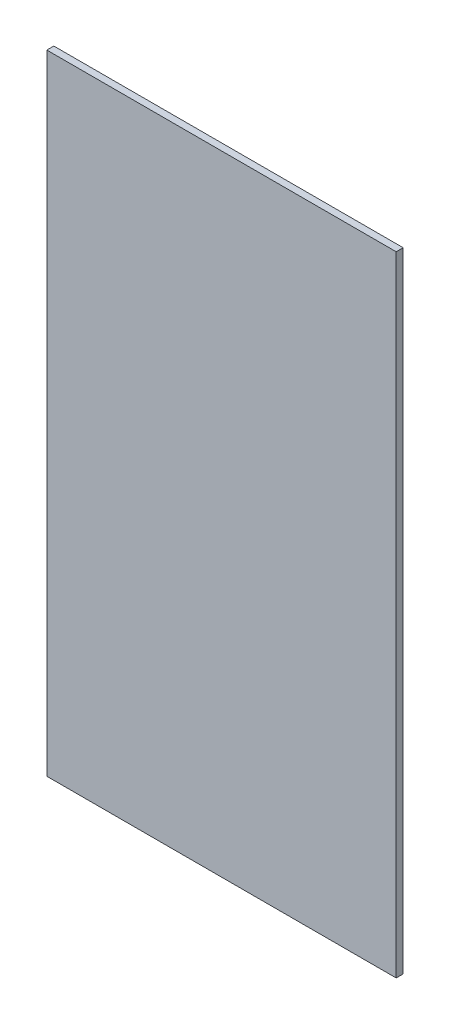
ISO-10303-21;
HEADER;
FILE_DESCRIPTION(('STEP AP214'),'2;1');
FILE_NAME('part.step','',(''),(''),'','','');
FILE_SCHEMA(('AUTOMOTIVE_DESIGN { 1 0 10303 214 1 1 1 1 }'));
ENDSEC;
DATA;
#1=APPLICATION_CONTEXT('core data for automotive mechanical design processes');
#2=APPLICATION_PROTOCOL_DEFINITION('international standard','automotive_design',2000,#1);
#3=PRODUCT_CONTEXT('',#1,'mechanical');
#4=PRODUCT('Part','Part','',(#3));
#5=PRODUCT_RELATED_PRODUCT_CATEGORY('part','',(#4));
#6=PRODUCT_DEFINITION_FORMATION('','',#4);
#7=PRODUCT_DEFINITION_CONTEXT('part definition',#1,'design');
#8=PRODUCT_DEFINITION('design','',#6,#7);
#9=PRODUCT_DEFINITION_SHAPE('','',#8);
#10=(LENGTH_UNIT() NAMED_UNIT(*) SI_UNIT(.MILLI.,.METRE.));
#11=(NAMED_UNIT(*) PLANE_ANGLE_UNIT() SI_UNIT($,.RADIAN.));
#12=(NAMED_UNIT(*) SI_UNIT($,.STERADIAN.) SOLID_ANGLE_UNIT());
#13=UNCERTAINTY_MEASURE_WITH_UNIT(LENGTH_MEASURE(1.E-05),#10,'distance_accuracy_value','');
#14=(GEOMETRIC_REPRESENTATION_CONTEXT(3) GLOBAL_UNCERTAINTY_ASSIGNED_CONTEXT((#13)) GLOBAL_UNIT_ASSIGNED_CONTEXT((#10,
#11,#12)) REPRESENTATION_CONTEXT('',''));
#15=CARTESIAN_POINT('',(0.,0.,0.));
#16=DIRECTION('',(0.,0.,1.));
#17=DIRECTION('',(1.,0.,0.));
#18=AXIS2_PLACEMENT_3D('',#15,#16,#17);
#19=CARTESIAN_POINT('',(2500.,4500.,50.));
#20=DIRECTION('',(-1.,0.,0.));
#21=DIRECTION('',(0.,-1.,0.));
#22=AXIS2_PLACEMENT_3D('',#19,#20,#21);
#23=PLANE('',#22);
#24=DIRECTION('',(0.,1.,0.));
#25=VECTOR('',#24,1.);
#26=CARTESIAN_POINT('',(2500.,4500.,-50.));
#27=LINE('',#26,#25);
#28=CARTESIAN_POINT('',(2500.,-4500.,-50.));
#29=VERTEX_POINT('',#28);
#30=CARTESIAN_POINT('',(2500.,4500.,-50.));
#31=VERTEX_POINT('',#30);
#32=EDGE_CURVE('E98',#29,#31,#27,.T.);
#33=ORIENTED_EDGE('',*,*,#32,.T.);
#34=DIRECTION('',(0.,0.,-1.));
#35=VECTOR('',#34,1.);
#36=CARTESIAN_POINT('',(2500.,4500.,50.));
#37=LINE('',#36,#35);
#38=CARTESIAN_POINT('',(2500.,4500.,50.));
#39=VERTEX_POINT('',#38);
#40=EDGE_CURVE('E11',#39,#31,#37,.T.);
#41=ORIENTED_EDGE('',*,*,#40,.F.);
#42=DIRECTION('',(0.,1.,0.));
#43=VECTOR('',#42,1.);
#44=CARTESIAN_POINT('',(2500.,4500.,50.));
#45=LINE('',#44,#43);
#46=CARTESIAN_POINT('',(2500.,-4500.,50.));
#47=VERTEX_POINT('',#46);
#48=EDGE_CURVE('E86',#47,#39,#45,.T.);
#49=ORIENTED_EDGE('',*,*,#48,.F.);
#50=DIRECTION('',(0.,0.,-1.));
#51=VECTOR('',#50,1.);
#52=CARTESIAN_POINT('',(2500.,-4500.,50.));
#53=LINE('',#52,#51);
#54=EDGE_CURVE('E94',#47,#29,#53,.T.);
#55=ORIENTED_EDGE('',*,*,#54,.T.);
#56=EDGE_LOOP('',(#33,#41,#49,#55));
#57=FACE_BOUND('',#56,.T.);
#58=ADVANCED_FACE('F35',(#57),#23,.F.);
#59=CARTESIAN_POINT('',(-2500.,4500.,50.));
#60=DIRECTION('',(0.,-1.,0.));
#61=DIRECTION('',(0.,0.,-1.));
#62=AXIS2_PLACEMENT_3D('',#59,#60,#61);
#63=PLANE('',#62);
#64=DIRECTION('',(-1.,0.,0.));
#65=VECTOR('',#64,1.);
#66=CARTESIAN_POINT('',(-2500.,4500.,-50.));
#67=LINE('',#66,#65);
#68=CARTESIAN_POINT('',(-2500.,4500.,-50.));
#69=VERTEX_POINT('',#68);
#70=EDGE_CURVE('E90',#31,#69,#67,.T.);
#71=ORIENTED_EDGE('',*,*,#70,.T.);
#72=DIRECTION('',(0.,0.,-1.));
#73=VECTOR('',#72,1.);
#74=CARTESIAN_POINT('',(-2500.,4500.,50.));
#75=LINE('',#74,#73);
#76=CARTESIAN_POINT('',(-2500.,4500.,50.));
#77=VERTEX_POINT('',#76);
#78=EDGE_CURVE('E43',#77,#69,#75,.T.);
#79=ORIENTED_EDGE('',*,*,#78,.F.);
#80=DIRECTION('',(-1.,0.,0.));
#81=VECTOR('',#80,1.);
#82=CARTESIAN_POINT('',(-2500.,4500.,50.));
#83=LINE('',#82,#81);
#84=EDGE_CURVE('E81',#39,#77,#83,.T.);
#85=ORIENTED_EDGE('',*,*,#84,.F.);
#86=ORIENTED_EDGE('',*,*,#40,.T.);
#87=EDGE_LOOP('',(#71,#79,#85,#86));
#88=FACE_BOUND('',#87,.T.);
#89=ADVANCED_FACE('F89',(#88),#63,.F.);
#90=CARTESIAN_POINT('',(-2500.,4500.,50.));
#91=DIRECTION('',(1.,0.,0.));
#92=DIRECTION('',(0.,1.,0.));
#93=AXIS2_PLACEMENT_3D('',#90,#91,#92);
#94=PLANE('',#93);
#95=DIRECTION('',(0.,-1.,0.));
#96=VECTOR('',#95,1.);
#97=CARTESIAN_POINT('',(-2500.,4500.,-50.));
#98=LINE('',#97,#96);
#99=CARTESIAN_POINT('',(-2500.,-4500.,-50.));
#100=VERTEX_POINT('',#99);
#101=EDGE_CURVE('E68',#69,#100,#98,.T.);
#102=ORIENTED_EDGE('',*,*,#101,.T.);
#103=DIRECTION('',(0.,0.,-1.));
#104=VECTOR('',#103,1.);
#105=CARTESIAN_POINT('',(-2500.,-4500.,50.));
#106=LINE('',#105,#104);
#107=CARTESIAN_POINT('',(-2500.,-4500.,50.));
#108=VERTEX_POINT('',#107);
#109=EDGE_CURVE('E91',#108,#100,#106,.T.);
#110=ORIENTED_EDGE('',*,*,#109,.F.);
#111=DIRECTION('',(0.,-1.,0.));
#112=VECTOR('',#111,1.);
#113=CARTESIAN_POINT('',(-2500.,4500.,50.));
#114=LINE('',#113,#112);
#115=EDGE_CURVE('E84',#77,#108,#114,.T.);
#116=ORIENTED_EDGE('',*,*,#115,.F.);
#117=ORIENTED_EDGE('',*,*,#78,.T.);
#118=EDGE_LOOP('',(#102,#110,#116,#117));
#119=FACE_BOUND('',#118,.T.);
#120=ADVANCED_FACE('F92',(#119),#94,.F.);
#121=CARTESIAN_POINT('',(-2500.,-4500.,50.));
#122=DIRECTION('',(0.,1.,0.));
#123=DIRECTION('',(0.,0.,1.));
#124=AXIS2_PLACEMENT_3D('',#121,#122,#123);
#125=PLANE('',#124);
#126=DIRECTION('',(1.,0.,0.));
#127=VECTOR('',#126,1.);
#128=CARTESIAN_POINT('',(-2500.,-4500.,-50.));
#129=LINE('',#128,#127);
#130=EDGE_CURVE('E74',#100,#29,#129,.T.);
#131=ORIENTED_EDGE('',*,*,#130,.T.);
#132=ORIENTED_EDGE('',*,*,#54,.F.);
#133=DIRECTION('',(1.,0.,0.));
#134=VECTOR('',#133,1.);
#135=CARTESIAN_POINT('',(-2500.,-4500.,50.));
#136=LINE('',#135,#134);
#137=EDGE_CURVE('E51',#108,#47,#136,.T.);
#138=ORIENTED_EDGE('',*,*,#137,.F.);
#139=ORIENTED_EDGE('',*,*,#109,.T.);
#140=EDGE_LOOP('',(#131,#132,#138,#139));
#141=FACE_BOUND('',#140,.T.);
#142=ADVANCED_FACE('F105',(#141),#125,.F.);
#143=CARTESIAN_POINT('',(0.,0.,50.));
#144=DIRECTION('',(0.,0.,1.));
#145=DIRECTION('',(1.,0.,0.));
#146=AXIS2_PLACEMENT_3D('',#143,#144,#145);
#147=PLANE('',#146);
#148=ORIENTED_EDGE('',*,*,#48,.T.);
#149=ORIENTED_EDGE('',*,*,#84,.T.);
#150=ORIENTED_EDGE('',*,*,#115,.T.);
#151=ORIENTED_EDGE('',*,*,#137,.T.);
#152=EDGE_LOOP('',(#148,#149,#150,#151));
#153=FACE_BOUND('',#152,.T.);
#154=ADVANCED_FACE('F82',(#153),#147,.T.);
#155=CARTESIAN_POINT('',(0.,0.,-50.));
#156=DIRECTION('',(0.,0.,1.));
#157=DIRECTION('',(1.,0.,0.));
#158=AXIS2_PLACEMENT_3D('',#155,#156,#157);
#159=PLANE('',#158);
#160=ORIENTED_EDGE('',*,*,#32,.F.);
#161=ORIENTED_EDGE('',*,*,#130,.F.);
#162=ORIENTED_EDGE('',*,*,#101,.F.);
#163=ORIENTED_EDGE('',*,*,#70,.F.);
#164=EDGE_LOOP('',(#160,#161,#162,#163));
#165=FACE_BOUND('',#164,.T.);
#166=ADVANCED_FACE('F108',(#165),#159,.F.);
#167=CLOSED_SHELL('',(#58,#89,#120,#142,#154,#166));
#168=MANIFOLD_SOLID_BREP('B2',#167);
#169=ADVANCED_BREP_SHAPE_REPRESENTATION('',(#18,#168),#14);
#170=SHAPE_DEFINITION_REPRESENTATION(#9,#169);
ENDSEC;
END-ISO-10303-21;
